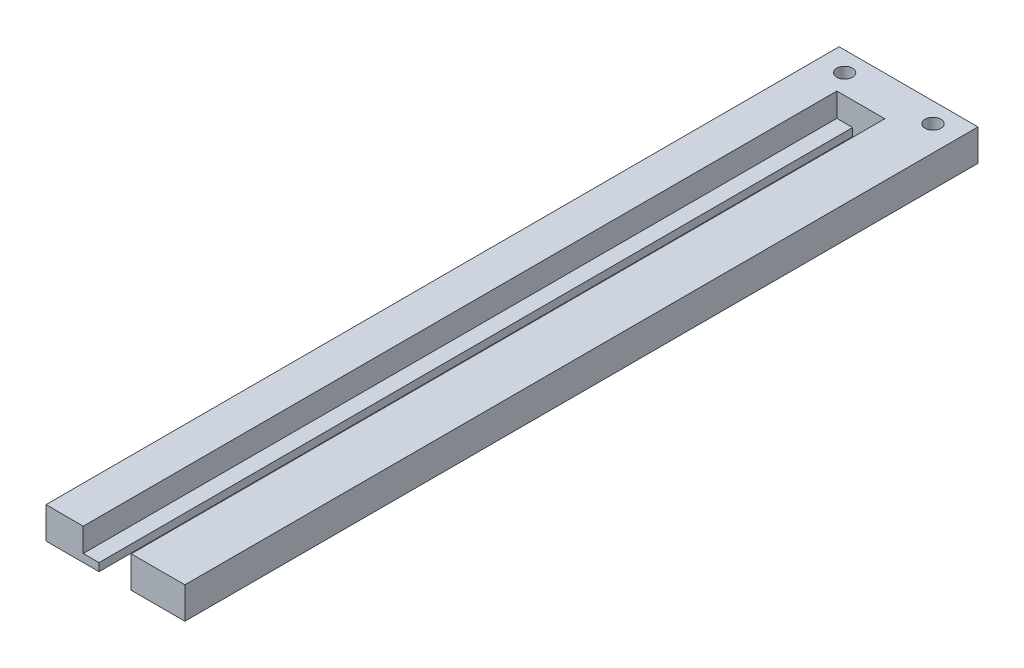
ISO-10303-21;
HEADER;
FILE_DESCRIPTION(('STEP AP214'),'2;1');
FILE_NAME('part.step','',(''),(''),'','','');
FILE_SCHEMA(('AUTOMOTIVE_DESIGN { 1 0 10303 214 1 1 1 1 }'));
ENDSEC;
DATA;
#1=APPLICATION_CONTEXT('core data for automotive mechanical design processes');
#2=APPLICATION_PROTOCOL_DEFINITION('international standard','automotive_design',2000,#1);
#3=PRODUCT_CONTEXT('',#1,'mechanical');
#4=PRODUCT('Part','Part','',(#3));
#5=PRODUCT_RELATED_PRODUCT_CATEGORY('part','',(#4));
#6=PRODUCT_DEFINITION_FORMATION('','',#4);
#7=PRODUCT_DEFINITION_CONTEXT('part definition',#1,'design');
#8=PRODUCT_DEFINITION('design','',#6,#7);
#9=PRODUCT_DEFINITION_SHAPE('','',#8);
#10=(LENGTH_UNIT() NAMED_UNIT(*) SI_UNIT(.MILLI.,.METRE.));
#11=(NAMED_UNIT(*) PLANE_ANGLE_UNIT() SI_UNIT($,.RADIAN.));
#12=(NAMED_UNIT(*) SI_UNIT($,.STERADIAN.) SOLID_ANGLE_UNIT());
#13=UNCERTAINTY_MEASURE_WITH_UNIT(LENGTH_MEASURE(1.E-05),#10,'distance_accuracy_value','');
#14=(GEOMETRIC_REPRESENTATION_CONTEXT(3) GLOBAL_UNCERTAINTY_ASSIGNED_CONTEXT((#13)) GLOBAL_UNIT_ASSIGNED_CONTEXT((#10,
#11,#12)) REPRESENTATION_CONTEXT('',''));
#15=CARTESIAN_POINT('',(0.,0.,0.));
#16=DIRECTION('',(0.,0.,1.));
#17=DIRECTION('',(1.,0.,0.));
#18=AXIS2_PLACEMENT_3D('',#15,#16,#17);
#19=CARTESIAN_POINT('',(0.,0.,7.9502));
#20=DIRECTION('',(0.,0.,-1.));
#21=DIRECTION('',(-1.,0.,0.));
#22=AXIS2_PLACEMENT_3D('',#19,#20,#21);
#23=PLANE('',#22);
#24=DIRECTION('',(0.,-1.,0.));
#25=VECTOR('',#24,1.);
#26=CARTESIAN_POINT('',(3.175,-3.175,7.9502));
#27=LINE('',#26,#25);
#28=CARTESIAN_POINT('',(3.175,3.175,7.9502));
#29=VERTEX_POINT('',#28);
#30=CARTESIAN_POINT('',(3.175,-3.175,7.9502));
#31=VERTEX_POINT('',#30);
#32=EDGE_CURVE('E48',#29,#31,#27,.T.);
#33=ORIENTED_EDGE('',*,*,#32,.F.);
#34=DIRECTION('',(-1.,0.,0.));
#35=VECTOR('',#34,1.);
#36=CARTESIAN_POINT('',(-13.97,3.175,7.9502));
#37=LINE('',#36,#35);
#38=CARTESIAN_POINT('',(-6.477,3.175,7.9502));
#39=VERTEX_POINT('',#38);
#40=EDGE_CURVE('E177',#29,#39,#37,.T.);
#41=ORIENTED_EDGE('',*,*,#40,.T.);
#42=DIRECTION('',(0.,1.,0.));
#43=VECTOR('',#42,1.);
#44=CARTESIAN_POINT('',(-6.477,-1.5875,7.9502));
#45=LINE('',#44,#43);
#46=CARTESIAN_POINT('',(-6.477,-1.5875,7.9502));
#47=VERTEX_POINT('',#46);
#48=EDGE_CURVE('E146',#47,#39,#45,.T.);
#49=ORIENTED_EDGE('',*,*,#48,.F.);
#50=DIRECTION('',(-1.,0.,0.));
#51=VECTOR('',#50,1.);
#52=CARTESIAN_POINT('',(-3.302,-1.5875,7.9502));
#53=LINE('',#52,#51);
#54=CARTESIAN_POINT('',(-3.302,-1.5875,7.9502));
#55=VERTEX_POINT('',#54);
#56=EDGE_CURVE('E161',#55,#47,#53,.T.);
#57=ORIENTED_EDGE('',*,*,#56,.F.);
#58=DIRECTION('',(0.,1.,0.));
#59=VECTOR('',#58,1.);
#60=CARTESIAN_POINT('',(-3.302,-3.175,7.9502));
#61=LINE('',#60,#59);
#62=CARTESIAN_POINT('',(-3.302,-3.175,7.9502));
#63=VERTEX_POINT('',#62);
#64=EDGE_CURVE('E141',#63,#55,#61,.T.);
#65=ORIENTED_EDGE('',*,*,#64,.F.);
#66=DIRECTION('',(1.,0.,0.));
#67=VECTOR('',#66,1.);
#68=CARTESIAN_POINT('',(-13.97,-3.175,7.9502));
#69=LINE('',#68,#67);
#70=EDGE_CURVE('E53',#63,#31,#69,.T.);
#71=ORIENTED_EDGE('',*,*,#70,.T.);
#72=EDGE_LOOP('',(#33,#41,#49,#57,#65,#71));
#73=FACE_BOUND('',#72,.T.);
#74=ADVANCED_FACE('F33',(#73),#23,.F.);
#75=CARTESIAN_POINT('',(13.97,-3.175,7.9502));
#76=DIRECTION('',(-1.,0.,0.));
#77=DIRECTION('',(0.,0.,1.));
#78=AXIS2_PLACEMENT_3D('',#75,#76,#77);
#79=PLANE('',#78);
#80=DIRECTION('',(0.,1.,0.));
#81=VECTOR('',#80,1.);
#82=CARTESIAN_POINT('',(13.97,-3.175,0.));
#83=LINE('',#82,#81);
#84=CARTESIAN_POINT('',(13.97,-3.175,0.));
#85=VERTEX_POINT('',#84);
#86=CARTESIAN_POINT('',(13.97,3.175,0.));
#87=VERTEX_POINT('',#86);
#88=EDGE_CURVE('E113',#85,#87,#83,.T.);
#89=ORIENTED_EDGE('',*,*,#88,.T.);
#90=DIRECTION('',(0.,0.,-1.));
#91=VECTOR('',#90,1.);
#92=CARTESIAN_POINT('',(13.97,3.175,7.9502));
#93=LINE('',#92,#91);
#94=CARTESIAN_POINT('',(13.97,3.175,159.55645));
#95=VERTEX_POINT('',#94);
#96=EDGE_CURVE('E11',#95,#87,#93,.T.);
#97=ORIENTED_EDGE('',*,*,#96,.F.);
#98=DIRECTION('',(0.,1.,0.));
#99=VECTOR('',#98,1.);
#100=CARTESIAN_POINT('',(13.97,-3.175,159.55645));
#101=LINE('',#100,#99);
#102=CARTESIAN_POINT('',(13.97,-3.175,159.55645));
#103=VERTEX_POINT('',#102);
#104=EDGE_CURVE('E111',#103,#95,#101,.T.);
#105=ORIENTED_EDGE('',*,*,#104,.F.);
#106=DIRECTION('',(0.,0.,-1.));
#107=VECTOR('',#106,1.);
#108=CARTESIAN_POINT('',(13.97,-3.175,7.9502));
#109=LINE('',#108,#107);
#110=EDGE_CURVE('E181',#103,#85,#109,.T.);
#111=ORIENTED_EDGE('',*,*,#110,.T.);
#112=EDGE_LOOP('',(#89,#97,#105,#111));
#113=FACE_BOUND('',#112,.T.);
#114=ADVANCED_FACE('F35',(#113),#79,.F.);
#115=CARTESIAN_POINT('',(-13.97,3.175,7.9502));
#116=DIRECTION('',(0.,-1.,0.));
#117=DIRECTION('',(0.,0.,-1.));
#118=AXIS2_PLACEMENT_3D('',#115,#116,#117);
#119=PLANE('',#118);
#120=CARTESIAN_POINT('',(-8.89,3.175,3.9751));
#121=DIRECTION('',(0.,1.,0.));
#122=DIRECTION('',(0.,0.,1.));
#123=AXIS2_PLACEMENT_3D('',#120,#121,#122);
#124=CIRCLE('',#123,1.5875);
#125=CARTESIAN_POINT('',(-8.89,3.175,5.5626));
#126=VERTEX_POINT('',#125);
#127=EDGE_CURVE('E250',#126,#126,#124,.T.);
#128=ORIENTED_EDGE('',*,*,#127,.F.);
#129=EDGE_LOOP('',(#128));
#130=FACE_BOUND('',#129,.T.);
#131=CARTESIAN_POINT('',(8.89,3.175,3.9751));
#132=DIRECTION('',(0.,1.,0.));
#133=DIRECTION('',(0.,0.,1.));
#134=AXIS2_PLACEMENT_3D('',#131,#132,#133);
#135=CIRCLE('',#134,1.5875);
#136=CARTESIAN_POINT('',(8.89,3.175,5.5626));
#137=VERTEX_POINT('',#136);
#138=EDGE_CURVE('E132',#137,#137,#135,.T.);
#139=ORIENTED_EDGE('',*,*,#138,.F.);
#140=EDGE_LOOP('',(#139));
#141=FACE_BOUND('',#140,.T.);
#142=DIRECTION('',(-1.,0.,0.));
#143=VECTOR('',#142,1.);
#144=CARTESIAN_POINT('',(-13.97,3.175,0.));
#145=LINE('',#144,#143);
#146=CARTESIAN_POINT('',(-13.97,3.175,0.));
#147=VERTEX_POINT('',#146);
#148=EDGE_CURVE('E183',#87,#147,#145,.T.);
#149=ORIENTED_EDGE('',*,*,#148,.T.);
#150=DIRECTION('',(0.,0.,-1.));
#151=VECTOR('',#150,1.);
#152=CARTESIAN_POINT('',(-13.97,3.175,7.9502));
#153=LINE('',#152,#151);
#154=CARTESIAN_POINT('',(-13.97,3.175,159.55645));
#155=VERTEX_POINT('',#154);
#156=EDGE_CURVE('E41',#155,#147,#153,.T.);
#157=ORIENTED_EDGE('',*,*,#156,.F.);
#158=DIRECTION('',(-1.,0.,0.));
#159=VECTOR('',#158,1.);
#160=CARTESIAN_POINT('',(-6.477,3.175,159.55645));
#161=LINE('',#160,#159);
#162=CARTESIAN_POINT('',(-6.477,3.175,159.55645));
#163=VERTEX_POINT('',#162);
#164=EDGE_CURVE('E152',#163,#155,#161,.T.);
#165=ORIENTED_EDGE('',*,*,#164,.F.);
#166=DIRECTION('',(0.,0.,-1.));
#167=VECTOR('',#166,1.);
#168=CARTESIAN_POINT('',(-6.477,3.175,159.55645));
#169=LINE('',#168,#167);
#170=EDGE_CURVE('E158',#163,#39,#169,.T.);
#171=ORIENTED_EDGE('',*,*,#170,.T.);
#172=ORIENTED_EDGE('',*,*,#40,.F.);
#173=DIRECTION('',(0.,0.,-1.));
#174=VECTOR('',#173,1.);
#175=CARTESIAN_POINT('',(3.175,3.175,159.55645));
#176=LINE('',#175,#174);
#177=CARTESIAN_POINT('',(3.175,3.175,159.55645));
#178=VERTEX_POINT('',#177);
#179=EDGE_CURVE('E119',#178,#29,#176,.T.);
#180=ORIENTED_EDGE('',*,*,#179,.F.);
#181=DIRECTION('',(-1.,0.,0.));
#182=VECTOR('',#181,1.);
#183=CARTESIAN_POINT('',(13.97,3.175,159.55645));
#184=LINE('',#183,#182);
#185=EDGE_CURVE('E116',#95,#178,#184,.T.);
#186=ORIENTED_EDGE('',*,*,#185,.F.);
#187=ORIENTED_EDGE('',*,*,#96,.T.);
#188=EDGE_LOOP('',(#149,#157,#165,#171,#172,#180,#186,#187));
#189=FACE_BOUND('',#188,.T.);
#190=ADVANCED_FACE('F117',(#130,#141,#189),#119,.F.);
#191=CARTESIAN_POINT('',(-13.97,-3.175,7.9502));
#192=DIRECTION('',(1.,0.,0.));
#193=DIRECTION('',(0.,0.,-1.));
#194=AXIS2_PLACEMENT_3D('',#191,#192,#193);
#195=PLANE('',#194);
#196=DIRECTION('',(0.,-1.,0.));
#197=VECTOR('',#196,1.);
#198=CARTESIAN_POINT('',(-13.97,-3.175,0.));
#199=LINE('',#198,#197);
#200=CARTESIAN_POINT('',(-13.97,-3.175,0.));
#201=VERTEX_POINT('',#200);
#202=EDGE_CURVE('E185',#147,#201,#199,.T.);
#203=ORIENTED_EDGE('',*,*,#202,.T.);
#204=DIRECTION('',(0.,0.,-1.));
#205=VECTOR('',#204,1.);
#206=CARTESIAN_POINT('',(-13.97,-3.175,7.9502));
#207=LINE('',#206,#205);
#208=CARTESIAN_POINT('',(-13.97,-3.175,159.55645));
#209=VERTEX_POINT('',#208);
#210=EDGE_CURVE('E189',#209,#201,#207,.T.);
#211=ORIENTED_EDGE('',*,*,#210,.F.);
#212=DIRECTION('',(0.,-1.,0.));
#213=VECTOR('',#212,1.);
#214=CARTESIAN_POINT('',(-13.97,3.175,159.55645));
#215=LINE('',#214,#213);
#216=EDGE_CURVE('E155',#155,#209,#215,.T.);
#217=ORIENTED_EDGE('',*,*,#216,.F.);
#218=ORIENTED_EDGE('',*,*,#156,.T.);
#219=EDGE_LOOP('',(#203,#211,#217,#218));
#220=FACE_BOUND('',#219,.T.);
#221=ADVANCED_FACE('F195',(#220),#195,.F.);
#222=CARTESIAN_POINT('',(-13.97,-3.175,7.9502));
#223=DIRECTION('',(0.,1.,0.));
#224=DIRECTION('',(0.,0.,1.));
#225=AXIS2_PLACEMENT_3D('',#222,#223,#224);
#226=PLANE('',#225);
#227=CARTESIAN_POINT('',(-8.89,-3.175,3.9751));
#228=DIRECTION('',(0.,1.,0.));
#229=DIRECTION('',(0.,0.,1.));
#230=AXIS2_PLACEMENT_3D('',#227,#228,#229);
#231=CIRCLE('',#230,1.5875);
#232=CARTESIAN_POINT('',(-8.89,-3.175,5.5626));
#233=VERTEX_POINT('',#232);
#234=EDGE_CURVE('E129',#233,#233,#231,.T.);
#235=ORIENTED_EDGE('',*,*,#234,.T.);
#236=EDGE_LOOP('',(#235));
#237=FACE_BOUND('',#236,.T.);
#238=CARTESIAN_POINT('',(8.89,-3.175,3.9751));
#239=DIRECTION('',(0.,1.,0.));
#240=DIRECTION('',(0.,0.,1.));
#241=AXIS2_PLACEMENT_3D('',#238,#239,#240);
#242=CIRCLE('',#241,1.5875);
#243=CARTESIAN_POINT('',(8.89,-3.175,5.5626));
#244=VERTEX_POINT('',#243);
#245=EDGE_CURVE('E254',#244,#244,#242,.T.);
#246=ORIENTED_EDGE('',*,*,#245,.T.);
#247=EDGE_LOOP('',(#246));
#248=FACE_BOUND('',#247,.T.);
#249=DIRECTION('',(1.,0.,0.));
#250=VECTOR('',#249,1.);
#251=CARTESIAN_POINT('',(-13.97,-3.175,0.));
#252=LINE('',#251,#250);
#253=EDGE_CURVE('E179',#201,#85,#252,.T.);
#254=ORIENTED_EDGE('',*,*,#253,.T.);
#255=ORIENTED_EDGE('',*,*,#110,.F.);
#256=DIRECTION('',(1.,0.,0.));
#257=VECTOR('',#256,1.);
#258=CARTESIAN_POINT('',(13.97,-3.175,159.55645));
#259=LINE('',#258,#257);
#260=CARTESIAN_POINT('',(3.175,-3.175,159.55645));
#261=VERTEX_POINT('',#260);
#262=EDGE_CURVE('E127',#261,#103,#259,.T.);
#263=ORIENTED_EDGE('',*,*,#262,.F.);
#264=DIRECTION('',(0.,0.,-1.));
#265=VECTOR('',#264,1.);
#266=CARTESIAN_POINT('',(3.175,-3.175,159.55645));
#267=LINE('',#266,#265);
#268=EDGE_CURVE('E136',#261,#31,#267,.T.);
#269=ORIENTED_EDGE('',*,*,#268,.T.);
#270=ORIENTED_EDGE('',*,*,#70,.F.);
#271=DIRECTION('',(0.,0.,-1.));
#272=VECTOR('',#271,1.);
#273=CARTESIAN_POINT('',(-3.302,-3.175,159.55645));
#274=LINE('',#273,#272);
#275=CARTESIAN_POINT('',(-3.302,-3.175,159.55645));
#276=VERTEX_POINT('',#275);
#277=EDGE_CURVE('E174',#276,#63,#274,.T.);
#278=ORIENTED_EDGE('',*,*,#277,.F.);
#279=DIRECTION('',(1.,0.,0.));
#280=VECTOR('',#279,1.);
#281=CARTESIAN_POINT('',(-13.97,-3.175,159.55645));
#282=LINE('',#281,#280);
#283=EDGE_CURVE('E142',#209,#276,#282,.T.);
#284=ORIENTED_EDGE('',*,*,#283,.F.);
#285=ORIENTED_EDGE('',*,*,#210,.T.);
#286=EDGE_LOOP('',(#254,#255,#263,#269,#270,#278,#284,#285));
#287=FACE_BOUND('',#286,.T.);
#288=ADVANCED_FACE('F201',(#237,#248,#287),#226,.F.);
#289=CARTESIAN_POINT('',(0.,0.,0.));
#290=DIRECTION('',(0.,0.,-1.));
#291=DIRECTION('',(-1.,0.,0.));
#292=AXIS2_PLACEMENT_3D('',#289,#290,#291);
#293=PLANE('',#292);
#294=ORIENTED_EDGE('',*,*,#88,.F.);
#295=ORIENTED_EDGE('',*,*,#253,.F.);
#296=ORIENTED_EDGE('',*,*,#202,.F.);
#297=ORIENTED_EDGE('',*,*,#148,.F.);
#298=EDGE_LOOP('',(#294,#295,#296,#297));
#299=FACE_BOUND('',#298,.T.);
#300=ADVANCED_FACE('F199',(#299),#293,.T.);
#301=CARTESIAN_POINT('',(-3.302,-3.175,159.55645));
#302=DIRECTION('',(-1.,0.,0.));
#303=DIRECTION('',(0.,0.,1.));
#304=AXIS2_PLACEMENT_3D('',#301,#302,#303);
#305=PLANE('',#304);
#306=ORIENTED_EDGE('',*,*,#64,.T.);
#307=DIRECTION('',(0.,0.,-1.));
#308=VECTOR('',#307,1.);
#309=CARTESIAN_POINT('',(-3.302,-1.5875,159.55645));
#310=LINE('',#309,#308);
#311=CARTESIAN_POINT('',(-3.302,-1.5875,159.55645));
#312=VERTEX_POINT('',#311);
#313=EDGE_CURVE('E171',#312,#55,#310,.T.);
#314=ORIENTED_EDGE('',*,*,#313,.F.);
#315=DIRECTION('',(0.,1.,0.));
#316=VECTOR('',#315,1.);
#317=CARTESIAN_POINT('',(-3.302,-3.175,159.55645));
#318=LINE('',#317,#316);
#319=EDGE_CURVE('E145',#276,#312,#318,.T.);
#320=ORIENTED_EDGE('',*,*,#319,.F.);
#321=ORIENTED_EDGE('',*,*,#277,.T.);
#322=EDGE_LOOP('',(#306,#314,#320,#321));
#323=FACE_BOUND('',#322,.T.);
#324=ADVANCED_FACE('F216',(#323),#305,.F.);
#325=CARTESIAN_POINT('',(-3.302,-1.5875,159.55645));
#326=DIRECTION('',(0.,-1.,0.));
#327=DIRECTION('',(1.,0.,0.));
#328=AXIS2_PLACEMENT_3D('',#325,#326,#327);
#329=PLANE('',#328);
#330=ORIENTED_EDGE('',*,*,#56,.T.);
#331=DIRECTION('',(0.,0.,-1.));
#332=VECTOR('',#331,1.);
#333=CARTESIAN_POINT('',(-6.477,-1.5875,159.55645));
#334=LINE('',#333,#332);
#335=CARTESIAN_POINT('',(-6.477,-1.5875,159.55645));
#336=VERTEX_POINT('',#335);
#337=EDGE_CURVE('E168',#336,#47,#334,.T.);
#338=ORIENTED_EDGE('',*,*,#337,.F.);
#339=DIRECTION('',(-1.,0.,0.));
#340=VECTOR('',#339,1.);
#341=CARTESIAN_POINT('',(-3.302,-1.5875,159.55645));
#342=LINE('',#341,#340);
#343=EDGE_CURVE('E148',#312,#336,#342,.T.);
#344=ORIENTED_EDGE('',*,*,#343,.F.);
#345=ORIENTED_EDGE('',*,*,#313,.T.);
#346=EDGE_LOOP('',(#330,#338,#344,#345));
#347=FACE_BOUND('',#346,.T.);
#348=ADVANCED_FACE('F212',(#347),#329,.F.);
#349=CARTESIAN_POINT('',(-6.477,-1.5875,159.55645));
#350=DIRECTION('',(-1.,0.,0.));
#351=DIRECTION('',(0.,-1.,0.));
#352=AXIS2_PLACEMENT_3D('',#349,#350,#351);
#353=PLANE('',#352);
#354=ORIENTED_EDGE('',*,*,#48,.T.);
#355=ORIENTED_EDGE('',*,*,#170,.F.);
#356=DIRECTION('',(0.,1.,0.));
#357=VECTOR('',#356,1.);
#358=CARTESIAN_POINT('',(-6.477,-1.5875,159.55645));
#359=LINE('',#358,#357);
#360=EDGE_CURVE('E150',#336,#163,#359,.T.);
#361=ORIENTED_EDGE('',*,*,#360,.F.);
#362=ORIENTED_EDGE('',*,*,#337,.T.);
#363=EDGE_LOOP('',(#354,#355,#361,#362));
#364=FACE_BOUND('',#363,.T.);
#365=ADVANCED_FACE('F209',(#364),#353,.F.);
#366=CARTESIAN_POINT('',(0.,0.,159.55645));
#367=DIRECTION('',(0.,0.,1.));
#368=DIRECTION('',(1.,0.,0.));
#369=AXIS2_PLACEMENT_3D('',#366,#367,#368);
#370=PLANE('',#369);
#371=ORIENTED_EDGE('',*,*,#283,.T.);
#372=ORIENTED_EDGE('',*,*,#319,.T.);
#373=ORIENTED_EDGE('',*,*,#343,.T.);
#374=ORIENTED_EDGE('',*,*,#360,.T.);
#375=ORIENTED_EDGE('',*,*,#164,.T.);
#376=ORIENTED_EDGE('',*,*,#216,.T.);
#377=EDGE_LOOP('',(#371,#372,#373,#374,#375,#376));
#378=FACE_BOUND('',#377,.T.);
#379=ADVANCED_FACE('F205',(#378),#370,.T.);
#380=CARTESIAN_POINT('',(3.175,-3.175,159.55645));
#381=DIRECTION('',(1.,0.,0.));
#382=DIRECTION('',(0.,0.,-1.));
#383=AXIS2_PLACEMENT_3D('',#380,#381,#382);
#384=PLANE('',#383);
#385=ORIENTED_EDGE('',*,*,#32,.T.);
#386=ORIENTED_EDGE('',*,*,#268,.F.);
#387=DIRECTION('',(0.,-1.,0.));
#388=VECTOR('',#387,1.);
#389=CARTESIAN_POINT('',(3.175,-3.175,159.55645));
#390=LINE('',#389,#388);
#391=EDGE_CURVE('E122',#178,#261,#390,.T.);
#392=ORIENTED_EDGE('',*,*,#391,.F.);
#393=ORIENTED_EDGE('',*,*,#179,.T.);
#394=EDGE_LOOP('',(#385,#386,#392,#393));
#395=FACE_BOUND('',#394,.T.);
#396=ADVANCED_FACE('F219',(#395),#384,.F.);
#397=CARTESIAN_POINT('',(0.,0.,159.55645));
#398=DIRECTION('',(0.,0.,1.));
#399=DIRECTION('',(1.,0.,0.));
#400=AXIS2_PLACEMENT_3D('',#397,#398,#399);
#401=PLANE('',#400);
#402=ORIENTED_EDGE('',*,*,#104,.T.);
#403=ORIENTED_EDGE('',*,*,#185,.T.);
#404=ORIENTED_EDGE('',*,*,#391,.T.);
#405=ORIENTED_EDGE('',*,*,#262,.T.);
#406=EDGE_LOOP('',(#402,#403,#404,#405));
#407=FACE_BOUND('',#406,.T.);
#408=ADVANCED_FACE('F125',(#407),#401,.T.);
#409=CARTESIAN_POINT('',(8.89,-3.175,3.9751));
#410=DIRECTION('',(0.,1.,0.));
#411=DIRECTION('',(0.,0.,1.));
#412=AXIS2_PLACEMENT_3D('',#409,#410,#411);
#413=CYLINDRICAL_SURFACE('',#412,1.5875);
#414=ORIENTED_EDGE('',*,*,#245,.F.);
#415=EDGE_LOOP('',(#414));
#416=FACE_BOUND('',#415,.T.);
#417=ORIENTED_EDGE('',*,*,#138,.T.);
#418=EDGE_LOOP('',(#417));
#419=FACE_BOUND('',#418,.T.);
#420=ADVANCED_FACE('F226',(#416,#419),#413,.F.);
#421=CARTESIAN_POINT('',(-8.89,-3.175,3.9751));
#422=DIRECTION('',(0.,1.,0.));
#423=DIRECTION('',(0.,0.,1.));
#424=AXIS2_PLACEMENT_3D('',#421,#422,#423);
#425=CYLINDRICAL_SURFACE('',#424,1.5875);
#426=ORIENTED_EDGE('',*,*,#234,.F.);
#427=EDGE_LOOP('',(#426));
#428=FACE_BOUND('',#427,.T.);
#429=ORIENTED_EDGE('',*,*,#127,.T.);
#430=EDGE_LOOP('',(#429));
#431=FACE_BOUND('',#430,.T.);
#432=ADVANCED_FACE('F263',(#428,#431),#425,.F.);
#433=CLOSED_SHELL('',(#74,#114,#190,#221,#288,#300,#324,#348,#365,#379,#396,#408,#420,#432));
#434=MANIFOLD_SOLID_BREP('B2',#433);
#435=ADVANCED_BREP_SHAPE_REPRESENTATION('',(#18,#434),#14);
#436=SHAPE_DEFINITION_REPRESENTATION(#9,#435);
ENDSEC;
END-ISO-10303-21;
